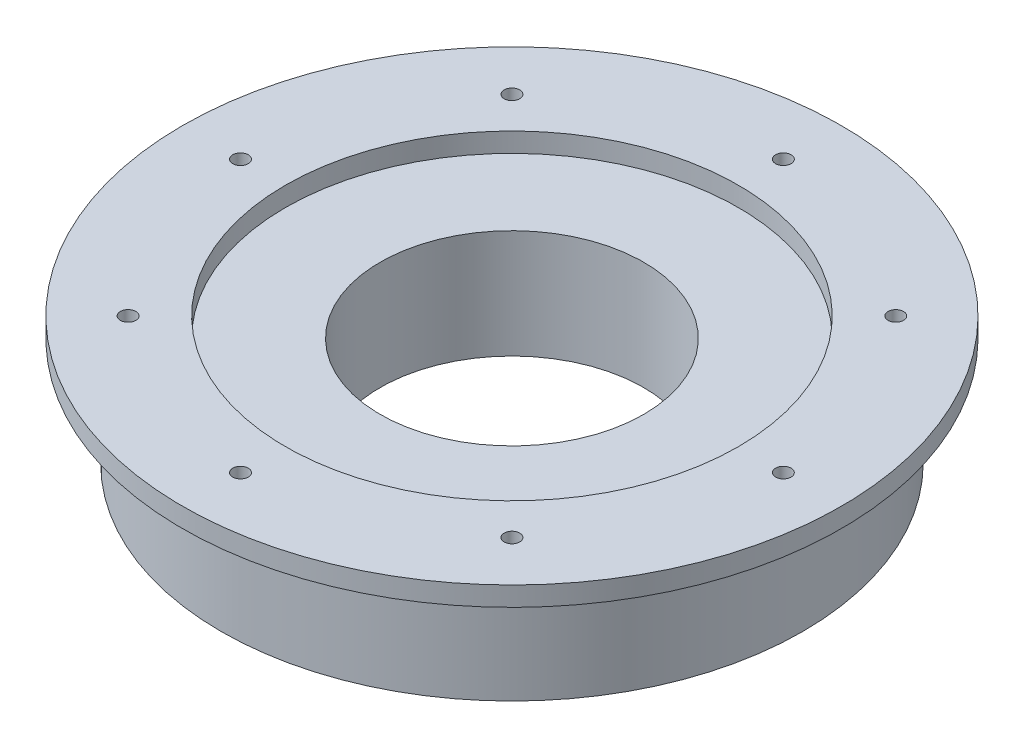
ISO-10303-21;
HEADER;
FILE_DESCRIPTION(('STEP AP214'),'2;1');
FILE_NAME('part.step','',(''),(''),'','','');
FILE_SCHEMA(('AUTOMOTIVE_DESIGN { 1 0 10303 214 1 1 1 1 }'));
ENDSEC;
DATA;
#1=APPLICATION_CONTEXT('core data for automotive mechanical design processes');
#2=APPLICATION_PROTOCOL_DEFINITION('international standard','automotive_design',2000,#1);
#3=PRODUCT_CONTEXT('',#1,'mechanical');
#4=PRODUCT('Part','Part','',(#3));
#5=PRODUCT_RELATED_PRODUCT_CATEGORY('part','',(#4));
#6=PRODUCT_DEFINITION_FORMATION('','',#4);
#7=PRODUCT_DEFINITION_CONTEXT('part definition',#1,'design');
#8=PRODUCT_DEFINITION('design','',#6,#7);
#9=PRODUCT_DEFINITION_SHAPE('','',#8);
#10=(LENGTH_UNIT() NAMED_UNIT(*) SI_UNIT(.MILLI.,.METRE.));
#11=(NAMED_UNIT(*) PLANE_ANGLE_UNIT() SI_UNIT($,.RADIAN.));
#12=(NAMED_UNIT(*) SI_UNIT($,.STERADIAN.) SOLID_ANGLE_UNIT());
#13=UNCERTAINTY_MEASURE_WITH_UNIT(LENGTH_MEASURE(1.E-05),#10,'distance_accuracy_value','');
#14=(GEOMETRIC_REPRESENTATION_CONTEXT(3) GLOBAL_UNCERTAINTY_ASSIGNED_CONTEXT((#13)) GLOBAL_UNIT_ASSIGNED_CONTEXT((#10,
#11,#12)) REPRESENTATION_CONTEXT('',''));
#15=CARTESIAN_POINT('',(0.,0.,0.));
#16=DIRECTION('',(0.,0.,1.));
#17=DIRECTION('',(1.,0.,0.));
#18=AXIS2_PLACEMENT_3D('',#15,#16,#17);
#19=CARTESIAN_POINT('',(0.,-64.3633008588991,0.));
#20=DIRECTION('',(0.,1.,0.));
#21=DIRECTION('',(-1.,0.,0.));
#22=AXIS2_PLACEMENT_3D('',#19,#20,#21);
#23=CYLINDRICAL_SURFACE('',#22,34.);
#24=CARTESIAN_POINT('',(0.,-64.3533008588991,0.));
#25=DIRECTION('',(0.,-1.,0.));
#26=DIRECTION('',(1.,0.,0.));
#27=AXIS2_PLACEMENT_3D('',#24,#25,#26);
#28=CIRCLE('',#27,34.);
#29=CARTESIAN_POINT('',(34.,-64.3533008588991,0.));
#30=VERTEX_POINT('',#29);
#31=EDGE_CURVE('E52',#30,#30,#28,.T.);
#32=ORIENTED_EDGE('',*,*,#31,.T.);
#33=EDGE_LOOP('',(#32));
#34=FACE_BOUND('',#33,.T.);
#35=CARTESIAN_POINT('',(0.,-36.3533008588991,0.));
#36=DIRECTION('',(0.,-1.,0.));
#37=DIRECTION('',(1.,0.,0.));
#38=AXIS2_PLACEMENT_3D('',#35,#36,#37);
#39=CIRCLE('',#38,34.);
#40=CARTESIAN_POINT('',(34.,-36.3533008588991,0.));
#41=VERTEX_POINT('',#40);
#42=EDGE_CURVE('E35',#41,#41,#39,.T.);
#43=ORIENTED_EDGE('',*,*,#42,.F.);
#44=EDGE_LOOP('',(#43));
#45=FACE_BOUND('',#44,.T.);
#46=ADVANCED_FACE('F31',(#34,#45),#23,.F.);
#47=CARTESIAN_POINT('',(0.,-31.3533008588991,0.));
#48=DIRECTION('',(0.,-1.,0.));
#49=DIRECTION('',(1.,0.,0.));
#50=AXIS2_PLACEMENT_3D('',#47,#48,#49);
#51=CYLINDRICAL_SURFACE('',#50,85.);
#52=CARTESIAN_POINT('',(0.,-31.3533008588991,0.));
#53=DIRECTION('',(0.,1.,0.));
#54=DIRECTION('',(-1.,0.,0.));
#55=AXIS2_PLACEMENT_3D('',#52,#53,#54);
#56=CIRCLE('',#55,85.);
#57=CARTESIAN_POINT('',(-85.,-31.3533008588991,0.));
#58=VERTEX_POINT('',#57);
#59=EDGE_CURVE('E66',#58,#58,#56,.T.);
#60=ORIENTED_EDGE('',*,*,#59,.F.);
#61=EDGE_LOOP('',(#60));
#62=FACE_BOUND('',#61,.T.);
#63=CARTESIAN_POINT('',(0.,-36.3533008588991,0.));
#64=DIRECTION('',(0.,1.,0.));
#65=DIRECTION('',(-1.,0.,0.));
#66=AXIS2_PLACEMENT_3D('',#63,#64,#65);
#67=CIRCLE('',#66,85.);
#68=CARTESIAN_POINT('',(-85.,-36.3533008588991,0.));
#69=VERTEX_POINT('',#68);
#70=EDGE_CURVE('E69',#69,#69,#67,.T.);
#71=ORIENTED_EDGE('',*,*,#70,.T.);
#72=EDGE_LOOP('',(#71));
#73=FACE_BOUND('',#72,.T.);
#74=ADVANCED_FACE('F156',(#62,#73),#51,.T.);
#75=CARTESIAN_POINT('',(0.,-36.3533008588991,0.));
#76=DIRECTION('',(0.,1.,0.));
#77=DIRECTION('',(-1.,0.,0.));
#78=AXIS2_PLACEMENT_3D('',#75,#76,#77);
#79=PLANE('',#78);
#80=CARTESIAN_POINT('',(0.,-36.3533008588991,0.));
#81=DIRECTION('',(0.,1.,0.));
#82=DIRECTION('',(-1.,0.,0.));
#83=AXIS2_PLACEMENT_3D('',#80,#81,#82);
#84=CIRCLE('',#83,75.);
#85=CARTESIAN_POINT('',(-75.,-36.3533008588991,0.));
#86=VERTEX_POINT('',#85);
#87=EDGE_CURVE('E61',#86,#86,#84,.T.);
#88=ORIENTED_EDGE('',*,*,#87,.T.);
#89=EDGE_LOOP('',(#88));
#90=FACE_BOUND('',#89,.T.);
#91=ORIENTED_EDGE('',*,*,#70,.F.);
#92=EDGE_LOOP('',(#91));
#93=FACE_BOUND('',#92,.T.);
#94=ADVANCED_FACE('F161',(#90,#93),#79,.F.);
#95=CARTESIAN_POINT('',(0.,-31.3533008588991,0.));
#96=DIRECTION('',(0.,1.,0.));
#97=DIRECTION('',(-1.,0.,0.));
#98=AXIS2_PLACEMENT_3D('',#95,#96,#97);
#99=PLANE('',#98);
#100=CARTESIAN_POINT('',(0.,-31.3533008588991,70.));
#101=DIRECTION('',(0.,1.,0.));
#102=DIRECTION('',(-1.,0.,0.));
#103=AXIS2_PLACEMENT_3D('',#100,#101,#102);
#104=CIRCLE('',#103,2.);
#105=CARTESIAN_POINT('',(-2.,-31.3533008588991,70.));
#106=VERTEX_POINT('',#105);
#107=EDGE_CURVE('E78',#106,#106,#104,.T.);
#108=ORIENTED_EDGE('',*,*,#107,.F.);
#109=EDGE_LOOP('',(#108));
#110=FACE_BOUND('',#109,.T.);
#111=CARTESIAN_POINT('',(49.4974746830584,-31.3533008588991,49.4974746830583));
#112=DIRECTION('',(0.,1.,0.));
#113=DIRECTION('',(-1.,0.,0.));
#114=AXIS2_PLACEMENT_3D('',#111,#112,#113);
#115=CIRCLE('',#114,2.);
#116=CARTESIAN_POINT('',(47.4974746830584,-31.3533008588991,49.4974746830583));
#117=VERTEX_POINT('',#116);
#118=EDGE_CURVE('E83',#117,#117,#115,.T.);
#119=ORIENTED_EDGE('',*,*,#118,.F.);
#120=EDGE_LOOP('',(#119));
#121=FACE_BOUND('',#120,.T.);
#122=CARTESIAN_POINT('',(70.,-31.3533008588991,-2.44403693719019E-13));
#123=DIRECTION('',(0.,1.,0.));
#124=DIRECTION('',(-1.,0.,0.));
#125=AXIS2_PLACEMENT_3D('',#122,#123,#124);
#126=CIRCLE('',#125,2.);
#127=CARTESIAN_POINT('',(68.,-31.3533008588991,-2.44403693719019E-13));
#128=VERTEX_POINT('',#127);
#129=EDGE_CURVE('E86',#128,#128,#126,.T.);
#130=ORIENTED_EDGE('',*,*,#129,.F.);
#131=EDGE_LOOP('',(#130));
#132=FACE_BOUND('',#131,.T.);
#133=CARTESIAN_POINT('',(49.4974746830581,-31.3533008588991,-49.4974746830586));
#134=DIRECTION('',(0.,1.,0.));
#135=DIRECTION('',(-1.,0.,0.));
#136=AXIS2_PLACEMENT_3D('',#133,#134,#135);
#137=CIRCLE('',#136,2.);
#138=CARTESIAN_POINT('',(47.4974746830581,-31.3533008588991,-49.4974746830586));
#139=VERTEX_POINT('',#138);
#140=EDGE_CURVE('E89',#139,#139,#137,.T.);
#141=ORIENTED_EDGE('',*,*,#140,.F.);
#142=EDGE_LOOP('',(#141));
#143=FACE_BOUND('',#142,.T.);
#144=CARTESIAN_POINT('',(-4.8434629101058E-13,-31.3533008588991,-70.));
#145=DIRECTION('',(0.,1.,0.));
#146=DIRECTION('',(-1.,0.,0.));
#147=AXIS2_PLACEMENT_3D('',#144,#145,#146);
#148=CIRCLE('',#147,2.);
#149=CARTESIAN_POINT('',(-2.00000000000048,-31.3533008588991,-70.));
#150=VERTEX_POINT('',#149);
#151=EDGE_CURVE('E92',#150,#150,#148,.T.);
#152=ORIENTED_EDGE('',*,*,#151,.F.);
#153=EDGE_LOOP('',(#152));
#154=FACE_BOUND('',#153,.T.);
#155=CARTESIAN_POINT('',(-49.4974746830588,-31.3533008588991,-49.4974746830579));
#156=DIRECTION('',(0.,1.,0.));
#157=DIRECTION('',(-1.,0.,0.));
#158=AXIS2_PLACEMENT_3D('',#155,#156,#157);
#159=CIRCLE('',#158,2.);
#160=CARTESIAN_POINT('',(-51.4974746830588,-31.3533008588991,-49.4974746830579));
#161=VERTEX_POINT('',#160);
#162=EDGE_CURVE('E95',#161,#161,#159,.T.);
#163=ORIENTED_EDGE('',*,*,#162,.F.);
#164=EDGE_LOOP('',(#163));
#165=FACE_BOUND('',#164,.T.);
#166=CARTESIAN_POINT('',(-70.,-31.3533008588991,7.33211081157058E-13));
#167=DIRECTION('',(0.,1.,0.));
#168=DIRECTION('',(-1.,0.,0.));
#169=AXIS2_PLACEMENT_3D('',#166,#167,#168);
#170=CIRCLE('',#169,2.);
#171=CARTESIAN_POINT('',(-72.,-31.3533008588991,7.33211081157058E-13));
#172=VERTEX_POINT('',#171);
#173=EDGE_CURVE('E98',#172,#172,#170,.T.);
#174=ORIENTED_EDGE('',*,*,#173,.F.);
#175=EDGE_LOOP('',(#174));
#176=FACE_BOUND('',#175,.T.);
#177=CARTESIAN_POINT('',(-49.4974746830577,-31.3533008588991,49.4974746830589));
#178=DIRECTION('',(0.,1.,0.));
#179=DIRECTION('',(-1.,0.,0.));
#180=AXIS2_PLACEMENT_3D('',#177,#178,#179);
#181=CIRCLE('',#180,2.);
#182=CARTESIAN_POINT('',(-51.4974746830577,-31.3533008588991,49.4974746830589));
#183=VERTEX_POINT('',#182);
#184=EDGE_CURVE('E101',#183,#183,#181,.T.);
#185=ORIENTED_EDGE('',*,*,#184,.F.);
#186=EDGE_LOOP('',(#185));
#187=FACE_BOUND('',#186,.T.);
#188=ORIENTED_EDGE('',*,*,#59,.T.);
#189=EDGE_LOOP('',(#188));
#190=FACE_BOUND('',#189,.T.);
#191=CARTESIAN_POINT('',(0.,-31.3533008588991,0.));
#192=DIRECTION('',(0.,1.,0.));
#193=DIRECTION('',(-1.,0.,0.));
#194=AXIS2_PLACEMENT_3D('',#191,#192,#193);
#195=CIRCLE('',#194,58.4139683001882);
#196=CARTESIAN_POINT('',(-58.4139683001882,-31.3533008588991,0.));
#197=VERTEX_POINT('',#196);
#198=EDGE_CURVE('E72',#197,#197,#195,.T.);
#199=ORIENTED_EDGE('',*,*,#198,.F.);
#200=EDGE_LOOP('',(#199));
#201=FACE_BOUND('',#200,.T.);
#202=ADVANCED_FACE('F150',(#110,#121,#132,#143,#154,#165,#176,#187,#190,#201),#99,.T.);
#203=CARTESIAN_POINT('',(0.,-64.3533008588991,0.));
#204=DIRECTION('',(0.,1.,0.));
#205=DIRECTION('',(-1.,0.,0.));
#206=AXIS2_PLACEMENT_3D('',#203,#204,#205);
#207=CYLINDRICAL_SURFACE('',#206,75.);
#208=CARTESIAN_POINT('',(0.,-64.3533008588991,0.));
#209=DIRECTION('',(0.,-1.,0.));
#210=DIRECTION('',(1.,0.,0.));
#211=AXIS2_PLACEMENT_3D('',#208,#209,#210);
#212=CIRCLE('',#211,75.);
#213=CARTESIAN_POINT('',(75.,-64.3533008588991,0.));
#214=VERTEX_POINT('',#213);
#215=EDGE_CURVE('E57',#214,#214,#212,.T.);
#216=ORIENTED_EDGE('',*,*,#215,.F.);
#217=EDGE_LOOP('',(#216));
#218=FACE_BOUND('',#217,.T.);
#219=ORIENTED_EDGE('',*,*,#87,.F.);
#220=EDGE_LOOP('',(#219));
#221=FACE_BOUND('',#220,.T.);
#222=ADVANCED_FACE('F139',(#218,#221),#207,.T.);
#223=CARTESIAN_POINT('',(-49.4974746830577,-13.5533008588991,49.4974746830589));
#224=DIRECTION('',(0.,-1.,0.));
#225=DIRECTION('',(1.,0.,0.));
#226=AXIS2_PLACEMENT_3D('',#223,#224,#225);
#227=CYLINDRICAL_SURFACE('',#226,2.);
#228=ORIENTED_EDGE('',*,*,#184,.T.);
#229=EDGE_LOOP('',(#228));
#230=FACE_BOUND('',#229,.T.);
#231=CARTESIAN_POINT('',(-49.4974746830577,-64.3533008588991,49.4974746830589));
#232=DIRECTION('',(0.,-1.,0.));
#233=DIRECTION('',(1.,0.,0.));
#234=AXIS2_PLACEMENT_3D('',#231,#232,#233);
#235=CIRCLE('',#234,2.);
#236=CARTESIAN_POINT('',(-47.4974746830577,-64.3533008588991,49.4974746830589));
#237=VERTEX_POINT('',#236);
#238=EDGE_CURVE('E104',#237,#237,#235,.T.);
#239=ORIENTED_EDGE('',*,*,#238,.T.);
#240=EDGE_LOOP('',(#239));
#241=FACE_BOUND('',#240,.T.);
#242=ADVANCED_FACE('F136',(#230,#241),#227,.F.);
#243=CARTESIAN_POINT('',(-70.,-13.5533008588991,7.33211081157058E-13));
#244=DIRECTION('',(0.,-1.,0.));
#245=DIRECTION('',(1.,0.,0.));
#246=AXIS2_PLACEMENT_3D('',#243,#244,#245);
#247=CYLINDRICAL_SURFACE('',#246,2.);
#248=ORIENTED_EDGE('',*,*,#173,.T.);
#249=EDGE_LOOP('',(#248));
#250=FACE_BOUND('',#249,.T.);
#251=CARTESIAN_POINT('',(-70.,-64.3533008588991,7.33211081157058E-13));
#252=DIRECTION('',(0.,-1.,0.));
#253=DIRECTION('',(1.,0.,0.));
#254=AXIS2_PLACEMENT_3D('',#251,#252,#253);
#255=CIRCLE('',#254,2.);
#256=CARTESIAN_POINT('',(-68.,-64.3533008588991,7.33211081157058E-13));
#257=VERTEX_POINT('',#256);
#258=EDGE_CURVE('E10',#257,#257,#255,.T.);
#259=ORIENTED_EDGE('',*,*,#258,.T.);
#260=EDGE_LOOP('',(#259));
#261=FACE_BOUND('',#260,.T.);
#262=ADVANCED_FACE('F138',(#250,#261),#247,.F.);
#263=CARTESIAN_POINT('',(-49.4974746830588,-13.5533008588991,-49.4974746830579));
#264=DIRECTION('',(0.,-1.,0.));
#265=DIRECTION('',(1.,0.,0.));
#266=AXIS2_PLACEMENT_3D('',#263,#264,#265);
#267=CYLINDRICAL_SURFACE('',#266,2.);
#268=ORIENTED_EDGE('',*,*,#162,.T.);
#269=EDGE_LOOP('',(#268));
#270=FACE_BOUND('',#269,.T.);
#271=CARTESIAN_POINT('',(-49.4974746830588,-64.3533008588991,-49.4974746830579));
#272=DIRECTION('',(0.,-1.,0.));
#273=DIRECTION('',(1.,0.,0.));
#274=AXIS2_PLACEMENT_3D('',#271,#272,#273);
#275=CIRCLE('',#274,2.);
#276=CARTESIAN_POINT('',(-47.4974746830588,-64.3533008588991,-49.4974746830579));
#277=VERTEX_POINT('',#276);
#278=EDGE_CURVE('E39',#277,#277,#275,.T.);
#279=ORIENTED_EDGE('',*,*,#278,.T.);
#280=EDGE_LOOP('',(#279));
#281=FACE_BOUND('',#280,.T.);
#282=ADVANCED_FACE('F146',(#270,#281),#267,.F.);
#283=CARTESIAN_POINT('',(-4.86878959477167E-13,-13.5533008588991,-70.));
#284=DIRECTION('',(0.,-1.,0.));
#285=DIRECTION('',(1.,0.,0.));
#286=AXIS2_PLACEMENT_3D('',#283,#284,#285);
#287=CYLINDRICAL_SURFACE('',#286,2.);
#288=ORIENTED_EDGE('',*,*,#151,.T.);
#289=EDGE_LOOP('',(#288));
#290=FACE_BOUND('',#289,.T.);
#291=CARTESIAN_POINT('',(-4.7965089441522E-13,-64.3533008588991,-70.));
#292=DIRECTION('',(0.,-1.,0.));
#293=DIRECTION('',(1.,0.,0.));
#294=AXIS2_PLACEMENT_3D('',#291,#292,#293);
#295=CIRCLE('',#294,2.);
#296=CARTESIAN_POINT('',(1.99999999999952,-64.3533008588991,-70.));
#297=VERTEX_POINT('',#296);
#298=EDGE_CURVE('E44',#297,#297,#295,.T.);
#299=ORIENTED_EDGE('',*,*,#298,.T.);
#300=EDGE_LOOP('',(#299));
#301=FACE_BOUND('',#300,.T.);
#302=ADVANCED_FACE('F166',(#290,#301),#287,.F.);
#303=CARTESIAN_POINT('',(49.4974746830581,-13.5533008588991,-49.4974746830586));
#304=DIRECTION('',(0.,-1.,0.));
#305=DIRECTION('',(1.,0.,0.));
#306=AXIS2_PLACEMENT_3D('',#303,#304,#305);
#307=CYLINDRICAL_SURFACE('',#306,2.);
#308=ORIENTED_EDGE('',*,*,#140,.T.);
#309=EDGE_LOOP('',(#308));
#310=FACE_BOUND('',#309,.T.);
#311=CARTESIAN_POINT('',(49.4974746830581,-64.3533008588991,-49.4974746830586));
#312=DIRECTION('',(0.,-1.,0.));
#313=DIRECTION('',(1.,0.,0.));
#314=AXIS2_PLACEMENT_3D('',#311,#312,#313);
#315=CIRCLE('',#314,2.);
#316=CARTESIAN_POINT('',(51.4974746830581,-64.3533008588991,-49.4974746830586));
#317=VERTEX_POINT('',#316);
#318=EDGE_CURVE('E51',#317,#317,#315,.T.);
#319=ORIENTED_EDGE('',*,*,#318,.T.);
#320=EDGE_LOOP('',(#319));
#321=FACE_BOUND('',#320,.T.);
#322=ADVANCED_FACE('F169',(#310,#321),#307,.F.);
#323=CARTESIAN_POINT('',(70.,-13.5533008588991,-2.44403693719019E-13));
#324=DIRECTION('',(0.,-1.,0.));
#325=DIRECTION('',(1.,0.,0.));
#326=AXIS2_PLACEMENT_3D('',#323,#324,#325);
#327=CYLINDRICAL_SURFACE('',#326,2.);
#328=ORIENTED_EDGE('',*,*,#129,.T.);
#329=EDGE_LOOP('',(#328));
#330=FACE_BOUND('',#329,.T.);
#331=CARTESIAN_POINT('',(70.,-64.3533008588991,-2.44403693719019E-13));
#332=DIRECTION('',(0.,-1.,0.));
#333=DIRECTION('',(1.,0.,0.));
#334=AXIS2_PLACEMENT_3D('',#331,#332,#333);
#335=CIRCLE('',#334,2.);
#336=CARTESIAN_POINT('',(72.,-64.3533008588991,-2.44403693719019E-13));
#337=VERTEX_POINT('',#336);
#338=EDGE_CURVE('E109',#337,#337,#335,.T.);
#339=ORIENTED_EDGE('',*,*,#338,.T.);
#340=EDGE_LOOP('',(#339));
#341=FACE_BOUND('',#340,.T.);
#342=ADVANCED_FACE('F180',(#330,#341),#327,.F.);
#343=CARTESIAN_POINT('',(49.4974746830584,-13.5533008588991,49.4974746830583));
#344=DIRECTION('',(0.,-1.,0.));
#345=DIRECTION('',(1.,0.,0.));
#346=AXIS2_PLACEMENT_3D('',#343,#344,#345);
#347=CYLINDRICAL_SURFACE('',#346,2.);
#348=ORIENTED_EDGE('',*,*,#118,.T.);
#349=EDGE_LOOP('',(#348));
#350=FACE_BOUND('',#349,.T.);
#351=CARTESIAN_POINT('',(49.4974746830584,-64.3533008588991,49.4974746830583));
#352=DIRECTION('',(0.,-1.,0.));
#353=DIRECTION('',(1.,0.,0.));
#354=AXIS2_PLACEMENT_3D('',#351,#352,#353);
#355=CIRCLE('',#354,2.);
#356=CARTESIAN_POINT('',(51.4974746830584,-64.3533008588991,49.4974746830583));
#357=VERTEX_POINT('',#356);
#358=EDGE_CURVE('E111',#357,#357,#355,.T.);
#359=ORIENTED_EDGE('',*,*,#358,.T.);
#360=EDGE_LOOP('',(#359));
#361=FACE_BOUND('',#360,.T.);
#362=ADVANCED_FACE('F176',(#350,#361),#347,.F.);
#363=CARTESIAN_POINT('',(0.,-13.5533008588991,70.));
#364=DIRECTION('',(0.,-1.,0.));
#365=DIRECTION('',(1.,0.,0.));
#366=AXIS2_PLACEMENT_3D('',#363,#364,#365);
#367=CYLINDRICAL_SURFACE('',#366,2.);
#368=ORIENTED_EDGE('',*,*,#107,.T.);
#369=EDGE_LOOP('',(#368));
#370=FACE_BOUND('',#369,.T.);
#371=CARTESIAN_POINT('',(0.,-64.3533008588991,70.));
#372=DIRECTION('',(0.,-1.,0.));
#373=DIRECTION('',(1.,0.,0.));
#374=AXIS2_PLACEMENT_3D('',#371,#372,#373);
#375=CIRCLE('',#374,2.);
#376=CARTESIAN_POINT('',(2.00000000000001,-64.3533008588991,70.));
#377=VERTEX_POINT('',#376);
#378=EDGE_CURVE('E47',#377,#377,#375,.T.);
#379=ORIENTED_EDGE('',*,*,#378,.T.);
#380=EDGE_LOOP('',(#379));
#381=FACE_BOUND('',#380,.T.);
#382=ADVANCED_FACE('F118',(#370,#381),#367,.F.);
#383=CARTESIAN_POINT('',(0.,-64.3533008588991,0.));
#384=DIRECTION('',(0.,-1.,0.));
#385=DIRECTION('',(1.,0.,0.));
#386=AXIS2_PLACEMENT_3D('',#383,#384,#385);
#387=PLANE('',#386);
#388=ORIENTED_EDGE('',*,*,#31,.F.);
#389=EDGE_LOOP('',(#388));
#390=FACE_BOUND('',#389,.T.);
#391=ORIENTED_EDGE('',*,*,#378,.F.);
#392=EDGE_LOOP('',(#391));
#393=FACE_BOUND('',#392,.T.);
#394=ORIENTED_EDGE('',*,*,#358,.F.);
#395=EDGE_LOOP('',(#394));
#396=FACE_BOUND('',#395,.T.);
#397=ORIENTED_EDGE('',*,*,#338,.F.);
#398=EDGE_LOOP('',(#397));
#399=FACE_BOUND('',#398,.T.);
#400=ORIENTED_EDGE('',*,*,#318,.F.);
#401=EDGE_LOOP('',(#400));
#402=FACE_BOUND('',#401,.T.);
#403=ORIENTED_EDGE('',*,*,#298,.F.);
#404=EDGE_LOOP('',(#403));
#405=FACE_BOUND('',#404,.T.);
#406=ORIENTED_EDGE('',*,*,#278,.F.);
#407=EDGE_LOOP('',(#406));
#408=FACE_BOUND('',#407,.T.);
#409=ORIENTED_EDGE('',*,*,#258,.F.);
#410=EDGE_LOOP('',(#409));
#411=FACE_BOUND('',#410,.T.);
#412=ORIENTED_EDGE('',*,*,#238,.F.);
#413=EDGE_LOOP('',(#412));
#414=FACE_BOUND('',#413,.T.);
#415=ORIENTED_EDGE('',*,*,#215,.T.);
#416=EDGE_LOOP('',(#415));
#417=FACE_BOUND('',#416,.T.);
#418=ADVANCED_FACE('F33',(#390,#393,#396,#399,#402,#405,#408,#411,#414,#417),#387,.T.);
#419=CARTESIAN_POINT('',(0.,-31.3533008588991,0.));
#420=DIRECTION('',(0.,-1.,0.));
#421=DIRECTION('',(1.,0.,0.));
#422=AXIS2_PLACEMENT_3D('',#419,#420,#421);
#423=CYLINDRICAL_SURFACE('',#422,58.4139683001882);
#424=ORIENTED_EDGE('',*,*,#198,.T.);
#425=EDGE_LOOP('',(#424));
#426=FACE_BOUND('',#425,.T.);
#427=CARTESIAN_POINT('',(0.,-36.3533008588991,0.));
#428=DIRECTION('',(0.,1.,0.));
#429=DIRECTION('',(-1.,0.,0.));
#430=AXIS2_PLACEMENT_3D('',#427,#428,#429);
#431=CIRCLE('',#430,58.4139683001882);
#432=CARTESIAN_POINT('',(-58.4139683001882,-36.3533008588991,0.));
#433=VERTEX_POINT('',#432);
#434=EDGE_CURVE('E75',#433,#433,#431,.T.);
#435=ORIENTED_EDGE('',*,*,#434,.F.);
#436=EDGE_LOOP('',(#435));
#437=FACE_BOUND('',#436,.T.);
#438=ADVANCED_FACE('F122',(#426,#437),#423,.F.);
#439=CARTESIAN_POINT('',(0.,-36.3533008588991,0.));
#440=DIRECTION('',(0.,-1.,0.));
#441=DIRECTION('',(1.,0.,0.));
#442=AXIS2_PLACEMENT_3D('',#439,#440,#441);
#443=PLANE('',#442);
#444=ORIENTED_EDGE('',*,*,#42,.T.);
#445=EDGE_LOOP('',(#444));
#446=FACE_BOUND('',#445,.T.);
#447=ORIENTED_EDGE('',*,*,#434,.T.);
#448=EDGE_LOOP('',(#447));
#449=FACE_BOUND('',#448,.T.);
#450=ADVANCED_FACE('F208',(#446,#449),#443,.F.);
#451=CLOSED_SHELL('',(#46,#74,#94,#202,#222,#242,#262,#282,#302,#322,#342,#362,#382,#418,#438,#450));
#452=MANIFOLD_SOLID_BREP('B2',#451);
#453=ADVANCED_BREP_SHAPE_REPRESENTATION('',(#18,#452),#14);
#454=SHAPE_DEFINITION_REPRESENTATION(#9,#453);
ENDSEC;
END-ISO-10303-21;
